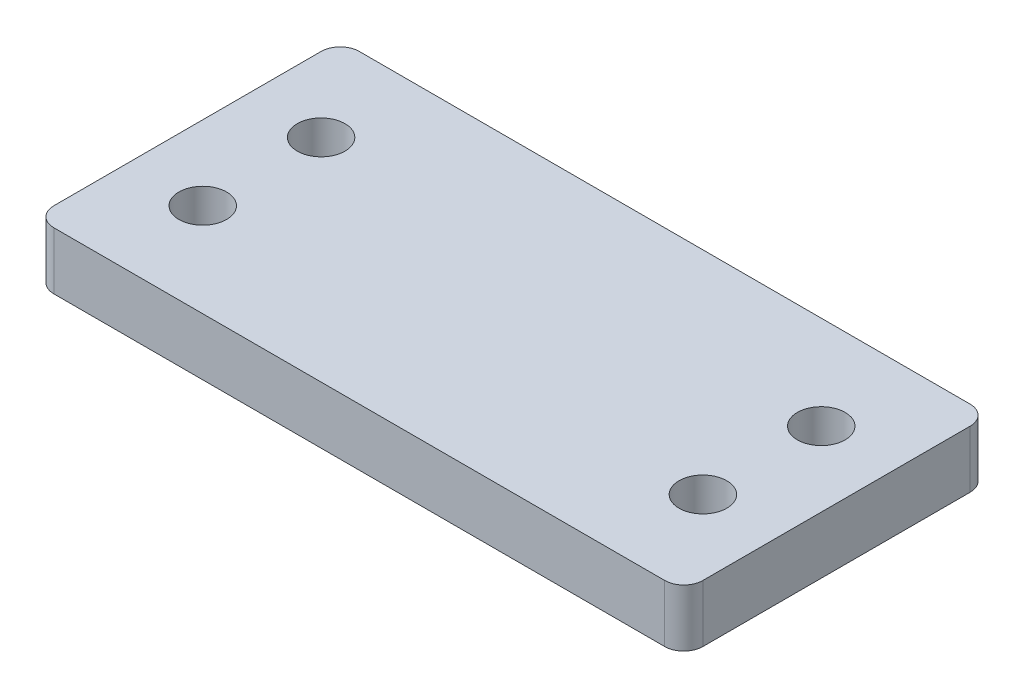
ISO-10303-21;
HEADER;
FILE_DESCRIPTION(('STEP AP214'),'2;1');
FILE_NAME('part.step','',(''),(''),'','','');
FILE_SCHEMA(('AUTOMOTIVE_DESIGN { 1 0 10303 214 1 1 1 1 }'));
ENDSEC;
DATA;
#1=APPLICATION_CONTEXT('core data for automotive mechanical design processes');
#2=APPLICATION_PROTOCOL_DEFINITION('international standard','automotive_design',2000,#1);
#3=PRODUCT_CONTEXT('',#1,'mechanical');
#4=PRODUCT('Part','Part','',(#3));
#5=PRODUCT_RELATED_PRODUCT_CATEGORY('part','',(#4));
#6=PRODUCT_DEFINITION_FORMATION('','',#4);
#7=PRODUCT_DEFINITION_CONTEXT('part definition',#1,'design');
#8=PRODUCT_DEFINITION('design','',#6,#7);
#9=PRODUCT_DEFINITION_SHAPE('','',#8);
#10=(LENGTH_UNIT() NAMED_UNIT(*) SI_UNIT(.MILLI.,.METRE.));
#11=(NAMED_UNIT(*) PLANE_ANGLE_UNIT() SI_UNIT($,.RADIAN.));
#12=(NAMED_UNIT(*) SI_UNIT($,.STERADIAN.) SOLID_ANGLE_UNIT());
#13=UNCERTAINTY_MEASURE_WITH_UNIT(LENGTH_MEASURE(1.E-05),#10,'distance_accuracy_value','');
#14=(GEOMETRIC_REPRESENTATION_CONTEXT(3) GLOBAL_UNCERTAINTY_ASSIGNED_CONTEXT((#13)) GLOBAL_UNIT_ASSIGNED_CONTEXT((#10,
#11,#12)) REPRESENTATION_CONTEXT('',''));
#15=CARTESIAN_POINT('',(0.,0.,0.));
#16=DIRECTION('',(0.,0.,1.));
#17=DIRECTION('',(1.,0.,0.));
#18=AXIS2_PLACEMENT_3D('',#15,#16,#17);
#19=CARTESIAN_POINT('',(0.,3.,0.));
#20=DIRECTION('',(0.,1.,0.));
#21=DIRECTION('',(0.,0.,1.));
#22=AXIS2_PLACEMENT_3D('',#19,#20,#21);
#23=PLANE('',#22);
#24=CARTESIAN_POINT('',(13.0999999996,3.,-3.10000000035001));
#25=DIRECTION('',(0.,1.,0.));
#26=DIRECTION('',(0.,0.,1.));
#27=AXIS2_PLACEMENT_3D('',#24,#25,#26);
#28=CIRCLE('',#27,1.2499999997);
#29=CARTESIAN_POINT('',(13.0999999996,3.,-1.85000000065001));
#30=VERTEX_POINT('',#29);
#31=EDGE_CURVE('E187',#30,#30,#28,.T.);
#32=ORIENTED_EDGE('',*,*,#31,.F.);
#33=EDGE_LOOP('',(#32));
#34=FACE_BOUND('',#33,.T.);
#35=CARTESIAN_POINT('',(-13.1,3.,3.10000000025));
#36=DIRECTION('',(0.,1.,0.));
#37=DIRECTION('',(0.,0.,1.));
#38=AXIS2_PLACEMENT_3D('',#35,#36,#37);
#39=CIRCLE('',#38,1.25000000025);
#40=CARTESIAN_POINT('',(-13.1,3.,4.35000000049999));
#41=VERTEX_POINT('',#40);
#42=EDGE_CURVE('E129',#41,#41,#39,.T.);
#43=ORIENTED_EDGE('',*,*,#42,.F.);
#44=EDGE_LOOP('',(#43));
#45=FACE_BOUND('',#44,.T.);
#46=DIRECTION('',(-1.,0.,0.));
#47=VECTOR('',#46,1.);
#48=CARTESIAN_POINT('',(-17.,3.,-8.));
#49=LINE('',#48,#47);
#50=CARTESIAN_POINT('',(16.,3.,-8.));
#51=VERTEX_POINT('',#50);
#52=CARTESIAN_POINT('',(-16.,3.,-8.));
#53=VERTEX_POINT('',#52);
#54=EDGE_CURVE('E138',#51,#53,#49,.T.);
#55=ORIENTED_EDGE('',*,*,#54,.T.);
#56=CARTESIAN_POINT('',(-16.,3.,-7.));
#57=DIRECTION('',(0.,1.,0.));
#58=DIRECTION('',(0.,0.,1.));
#59=AXIS2_PLACEMENT_3D('',#56,#57,#58);
#60=CIRCLE('',#59,1.);
#61=CARTESIAN_POINT('',(-17.,3.,-7.));
#62=VERTEX_POINT('',#61);
#63=EDGE_CURVE('E157',#53,#62,#60,.T.);
#64=ORIENTED_EDGE('',*,*,#63,.T.);
#65=DIRECTION('',(0.,0.,1.));
#66=VECTOR('',#65,1.);
#67=CARTESIAN_POINT('',(-17.,3.,-8.));
#68=LINE('',#67,#66);
#69=CARTESIAN_POINT('',(-17.,3.,7.));
#70=VERTEX_POINT('',#69);
#71=EDGE_CURVE('E121',#62,#70,#68,.T.);
#72=ORIENTED_EDGE('',*,*,#71,.T.);
#73=CARTESIAN_POINT('',(-16.,3.,7.));
#74=DIRECTION('',(0.,1.,0.));
#75=DIRECTION('',(0.,0.,1.));
#76=AXIS2_PLACEMENT_3D('',#73,#74,#75);
#77=CIRCLE('',#76,1.);
#78=CARTESIAN_POINT('',(-16.,3.,8.));
#79=VERTEX_POINT('',#78);
#80=EDGE_CURVE('E155',#70,#79,#77,.T.);
#81=ORIENTED_EDGE('',*,*,#80,.T.);
#82=DIRECTION('',(1.,0.,0.));
#83=VECTOR('',#82,1.);
#84=CARTESIAN_POINT('',(-17.,3.,8.));
#85=LINE('',#84,#83);
#86=CARTESIAN_POINT('',(16.,3.,8.));
#87=VERTEX_POINT('',#86);
#88=EDGE_CURVE('E177',#79,#87,#85,.T.);
#89=ORIENTED_EDGE('',*,*,#88,.T.);
#90=CARTESIAN_POINT('',(16.,3.,7.));
#91=DIRECTION('',(0.,1.,0.));
#92=DIRECTION('',(0.,0.,1.));
#93=AXIS2_PLACEMENT_3D('',#90,#91,#92);
#94=CIRCLE('',#93,1.);
#95=CARTESIAN_POINT('',(17.,3.,7.));
#96=VERTEX_POINT('',#95);
#97=EDGE_CURVE('E56',#87,#96,#94,.T.);
#98=ORIENTED_EDGE('',*,*,#97,.T.);
#99=DIRECTION('',(0.,0.,-1.));
#100=VECTOR('',#99,1.);
#101=CARTESIAN_POINT('',(17.,3.,-8.));
#102=LINE('',#101,#100);
#103=CARTESIAN_POINT('',(17.,3.,-7.));
#104=VERTEX_POINT('',#103);
#105=EDGE_CURVE('E167',#96,#104,#102,.T.);
#106=ORIENTED_EDGE('',*,*,#105,.T.);
#107=CARTESIAN_POINT('',(16.,3.,-7.));
#108=DIRECTION('',(0.,1.,0.));
#109=DIRECTION('',(0.,0.,1.));
#110=AXIS2_PLACEMENT_3D('',#107,#108,#109);
#111=CIRCLE('',#110,1.);
#112=EDGE_CURVE('E153',#104,#51,#111,.T.);
#113=ORIENTED_EDGE('',*,*,#112,.T.);
#114=EDGE_LOOP('',(#55,#64,#72,#81,#89,#98,#106,#113));
#115=FACE_BOUND('',#114,.T.);
#116=CARTESIAN_POINT('',(13.1,3.,3.10000000025));
#117=DIRECTION('',(0.,1.,0.));
#118=DIRECTION('',(0.,0.,1.));
#119=AXIS2_PLACEMENT_3D('',#116,#117,#118);
#120=CIRCLE('',#119,1.25000000025);
#121=CARTESIAN_POINT('',(13.1,3.,4.3500000005));
#122=VERTEX_POINT('',#121);
#123=EDGE_CURVE('E182',#122,#122,#120,.T.);
#124=ORIENTED_EDGE('',*,*,#123,.F.);
#125=EDGE_LOOP('',(#124));
#126=FACE_BOUND('',#125,.T.);
#127=CARTESIAN_POINT('',(-13.1,3.,-3.09999999975));
#128=DIRECTION('',(0.,1.,0.));
#129=DIRECTION('',(0.,0.,1.));
#130=AXIS2_PLACEMENT_3D('',#127,#128,#129);
#131=CIRCLE('',#130,1.2499999997);
#132=CARTESIAN_POINT('',(-13.1,3.,-1.85000000005));
#133=VERTEX_POINT('',#132);
#134=EDGE_CURVE('E193',#133,#133,#131,.T.);
#135=ORIENTED_EDGE('',*,*,#134,.F.);
#136=EDGE_LOOP('',(#135));
#137=FACE_BOUND('',#136,.T.);
#138=ADVANCED_FACE('F36',(#34,#45,#115,#126,#137),#23,.T.);
#139=CARTESIAN_POINT('',(0.,0.,0.));
#140=DIRECTION('',(0.,1.,0.));
#141=DIRECTION('',(0.,0.,1.));
#142=AXIS2_PLACEMENT_3D('',#139,#140,#141);
#143=PLANE('',#142);
#144=DIRECTION('',(0.,0.,1.));
#145=VECTOR('',#144,1.);
#146=CARTESIAN_POINT('',(-17.,0.,-8.));
#147=LINE('',#146,#145);
#148=CARTESIAN_POINT('',(-17.,0.,-7.));
#149=VERTEX_POINT('',#148);
#150=CARTESIAN_POINT('',(-17.,0.,7.));
#151=VERTEX_POINT('',#150);
#152=EDGE_CURVE('E118',#149,#151,#147,.T.);
#153=ORIENTED_EDGE('',*,*,#152,.F.);
#154=CARTESIAN_POINT('',(-16.,0.,-7.));
#155=DIRECTION('',(0.,1.,0.));
#156=DIRECTION('',(0.,0.,1.));
#157=AXIS2_PLACEMENT_3D('',#154,#155,#156);
#158=CIRCLE('',#157,1.);
#159=CARTESIAN_POINT('',(-16.,0.,-8.));
#160=VERTEX_POINT('',#159);
#161=EDGE_CURVE('E101',#149,#160,#158,.F.);
#162=ORIENTED_EDGE('',*,*,#161,.T.);
#163=DIRECTION('',(-1.,0.,0.));
#164=VECTOR('',#163,1.);
#165=CARTESIAN_POINT('',(-17.,0.,-8.));
#166=LINE('',#165,#164);
#167=CARTESIAN_POINT('',(16.,0.,-8.));
#168=VERTEX_POINT('',#167);
#169=EDGE_CURVE('E142',#168,#160,#166,.T.);
#170=ORIENTED_EDGE('',*,*,#169,.F.);
#171=CARTESIAN_POINT('',(16.,0.,-7.));
#172=DIRECTION('',(0.,1.,0.));
#173=DIRECTION('',(0.,0.,1.));
#174=AXIS2_PLACEMENT_3D('',#171,#172,#173);
#175=CIRCLE('',#174,1.);
#176=CARTESIAN_POINT('',(17.,0.,-7.));
#177=VERTEX_POINT('',#176);
#178=EDGE_CURVE('E146',#168,#177,#175,.F.);
#179=ORIENTED_EDGE('',*,*,#178,.T.);
#180=DIRECTION('',(0.,0.,-1.));
#181=VECTOR('',#180,1.);
#182=CARTESIAN_POINT('',(17.,0.,-8.));
#183=LINE('',#182,#181);
#184=CARTESIAN_POINT('',(17.,0.,7.));
#185=VERTEX_POINT('',#184);
#186=EDGE_CURVE('E132',#185,#177,#183,.T.);
#187=ORIENTED_EDGE('',*,*,#186,.F.);
#188=CARTESIAN_POINT('',(16.,0.,7.));
#189=DIRECTION('',(0.,1.,0.));
#190=DIRECTION('',(0.,0.,1.));
#191=AXIS2_PLACEMENT_3D('',#188,#189,#190);
#192=CIRCLE('',#191,1.);
#193=CARTESIAN_POINT('',(16.,0.,8.));
#194=VERTEX_POINT('',#193);
#195=EDGE_CURVE('E122',#185,#194,#192,.F.);
#196=ORIENTED_EDGE('',*,*,#195,.T.);
#197=DIRECTION('',(1.,0.,0.));
#198=VECTOR('',#197,1.);
#199=CARTESIAN_POINT('',(-17.,0.,8.));
#200=LINE('',#199,#198);
#201=CARTESIAN_POINT('',(-16.,0.,8.));
#202=VERTEX_POINT('',#201);
#203=EDGE_CURVE('E128',#202,#194,#200,.T.);
#204=ORIENTED_EDGE('',*,*,#203,.F.);
#205=CARTESIAN_POINT('',(-16.,0.,7.));
#206=DIRECTION('',(0.,1.,0.));
#207=DIRECTION('',(0.,0.,1.));
#208=AXIS2_PLACEMENT_3D('',#205,#206,#207);
#209=CIRCLE('',#208,1.);
#210=EDGE_CURVE('E112',#202,#151,#209,.F.);
#211=ORIENTED_EDGE('',*,*,#210,.T.);
#212=EDGE_LOOP('',(#153,#162,#170,#179,#187,#196,#204,#211));
#213=FACE_BOUND('',#212,.T.);
#214=CARTESIAN_POINT('',(-13.1,0.,3.10000000025));
#215=DIRECTION('',(0.,1.,0.));
#216=DIRECTION('',(0.,0.,1.));
#217=AXIS2_PLACEMENT_3D('',#214,#215,#216);
#218=CIRCLE('',#217,1.25000000025);
#219=CARTESIAN_POINT('',(-13.1,0.,4.35000000049999));
#220=VERTEX_POINT('',#219);
#221=EDGE_CURVE('E135',#220,#220,#218,.T.);
#222=ORIENTED_EDGE('',*,*,#221,.T.);
#223=EDGE_LOOP('',(#222));
#224=FACE_BOUND('',#223,.T.);
#225=CARTESIAN_POINT('',(13.0999999998,0.,3.10000000025));
#226=DIRECTION('',(0.,1.,0.));
#227=DIRECTION('',(0.,0.,1.));
#228=AXIS2_PLACEMENT_3D('',#225,#226,#227);
#229=CIRCLE('',#228,1.25000000025);
#230=CARTESIAN_POINT('',(13.0999999998,0.,4.3500000005));
#231=VERTEX_POINT('',#230);
#232=EDGE_CURVE('E184',#231,#231,#229,.T.);
#233=ORIENTED_EDGE('',*,*,#232,.T.);
#234=EDGE_LOOP('',(#233));
#235=FACE_BOUND('',#234,.T.);
#236=CARTESIAN_POINT('',(13.0999999998,0.,-3.10000000035001));
#237=DIRECTION('',(0.,1.,0.));
#238=DIRECTION('',(0.,0.,1.));
#239=AXIS2_PLACEMENT_3D('',#236,#237,#238);
#240=CIRCLE('',#239,1.2499999997);
#241=CARTESIAN_POINT('',(13.0999999998,0.,-1.85000000065001));
#242=VERTEX_POINT('',#241);
#243=EDGE_CURVE('E190',#242,#242,#240,.T.);
#244=ORIENTED_EDGE('',*,*,#243,.T.);
#245=EDGE_LOOP('',(#244));
#246=FACE_BOUND('',#245,.T.);
#247=CARTESIAN_POINT('',(-13.1,0.,-3.09999999975));
#248=DIRECTION('',(0.,1.,0.));
#249=DIRECTION('',(0.,0.,1.));
#250=AXIS2_PLACEMENT_3D('',#247,#248,#249);
#251=CIRCLE('',#250,1.2499999997);
#252=CARTESIAN_POINT('',(-13.1,0.,-1.85000000005));
#253=VERTEX_POINT('',#252);
#254=EDGE_CURVE('E196',#253,#253,#251,.T.);
#255=ORIENTED_EDGE('',*,*,#254,.T.);
#256=EDGE_LOOP('',(#255));
#257=FACE_BOUND('',#256,.T.);
#258=ADVANCED_FACE('F125',(#213,#224,#235,#246,#257),#143,.F.);
#259=CARTESIAN_POINT('',(-17.,3.,-8.));
#260=DIRECTION('',(1.,0.,0.));
#261=DIRECTION('',(0.,0.,-1.));
#262=AXIS2_PLACEMENT_3D('',#259,#260,#261);
#263=PLANE('',#262);
#264=ORIENTED_EDGE('',*,*,#71,.F.);
#265=DIRECTION('',(0.,-1.,0.));
#266=VECTOR('',#265,1.);
#267=CARTESIAN_POINT('',(-17.,3.,-7.));
#268=LINE('',#267,#266);
#269=EDGE_CURVE('E105',#62,#149,#268,.T.);
#270=ORIENTED_EDGE('',*,*,#269,.T.);
#271=ORIENTED_EDGE('',*,*,#152,.T.);
#272=DIRECTION('',(0.,-1.,0.));
#273=VECTOR('',#272,1.);
#274=CARTESIAN_POINT('',(-17.,3.,7.));
#275=LINE('',#274,#273);
#276=EDGE_CURVE('E123',#151,#70,#275,.F.);
#277=ORIENTED_EDGE('',*,*,#276,.T.);
#278=EDGE_LOOP('',(#264,#270,#271,#277));
#279=FACE_BOUND('',#278,.T.);
#280=ADVANCED_FACE('F117',(#279),#263,.F.);
#281=CARTESIAN_POINT('',(-17.,3.,8.));
#282=DIRECTION('',(0.,0.,-1.));
#283=DIRECTION('',(-1.,0.,0.));
#284=AXIS2_PLACEMENT_3D('',#281,#282,#283);
#285=PLANE('',#284);
#286=ORIENTED_EDGE('',*,*,#88,.F.);
#287=DIRECTION('',(0.,-1.,0.));
#288=VECTOR('',#287,1.);
#289=CARTESIAN_POINT('',(-16.,3.,8.));
#290=LINE('',#289,#288);
#291=EDGE_CURVE('E161',#79,#202,#290,.T.);
#292=ORIENTED_EDGE('',*,*,#291,.T.);
#293=ORIENTED_EDGE('',*,*,#203,.T.);
#294=DIRECTION('',(0.,-1.,0.));
#295=VECTOR('',#294,1.);
#296=CARTESIAN_POINT('',(16.,3.,8.));
#297=LINE('',#296,#295);
#298=EDGE_CURVE('E159',#194,#87,#297,.F.);
#299=ORIENTED_EDGE('',*,*,#298,.T.);
#300=EDGE_LOOP('',(#286,#292,#293,#299));
#301=FACE_BOUND('',#300,.T.);
#302=ADVANCED_FACE('F221',(#301),#285,.F.);
#303=CARTESIAN_POINT('',(17.,3.,-8.));
#304=DIRECTION('',(-1.,0.,0.));
#305=DIRECTION('',(0.,0.,1.));
#306=AXIS2_PLACEMENT_3D('',#303,#304,#305);
#307=PLANE('',#306);
#308=ORIENTED_EDGE('',*,*,#186,.T.);
#309=DIRECTION('',(0.,-1.,0.));
#310=VECTOR('',#309,1.);
#311=CARTESIAN_POINT('',(17.,3.,-7.));
#312=LINE('',#311,#310);
#313=EDGE_CURVE('E11',#177,#104,#312,.F.);
#314=ORIENTED_EDGE('',*,*,#313,.T.);
#315=ORIENTED_EDGE('',*,*,#105,.F.);
#316=DIRECTION('',(0.,-1.,0.));
#317=VECTOR('',#316,1.);
#318=CARTESIAN_POINT('',(17.,3.,7.));
#319=LINE('',#318,#317);
#320=EDGE_CURVE('E44',#96,#185,#319,.T.);
#321=ORIENTED_EDGE('',*,*,#320,.T.);
#322=EDGE_LOOP('',(#308,#314,#315,#321));
#323=FACE_BOUND('',#322,.T.);
#324=ADVANCED_FACE('F166',(#323),#307,.F.);
#325=CARTESIAN_POINT('',(-17.,3.,-8.));
#326=DIRECTION('',(0.,0.,1.));
#327=DIRECTION('',(1.,0.,0.));
#328=AXIS2_PLACEMENT_3D('',#325,#326,#327);
#329=PLANE('',#328);
#330=ORIENTED_EDGE('',*,*,#169,.T.);
#331=DIRECTION('',(0.,-1.,0.));
#332=VECTOR('',#331,1.);
#333=CARTESIAN_POINT('',(-16.,3.,-8.));
#334=LINE('',#333,#332);
#335=EDGE_CURVE('E106',#160,#53,#334,.F.);
#336=ORIENTED_EDGE('',*,*,#335,.T.);
#337=ORIENTED_EDGE('',*,*,#54,.F.);
#338=DIRECTION('',(0.,-1.,0.));
#339=VECTOR('',#338,1.);
#340=CARTESIAN_POINT('',(16.,3.,-8.));
#341=LINE('',#340,#339);
#342=EDGE_CURVE('E111',#51,#168,#341,.T.);
#343=ORIENTED_EDGE('',*,*,#342,.T.);
#344=EDGE_LOOP('',(#330,#336,#337,#343));
#345=FACE_BOUND('',#344,.T.);
#346=ADVANCED_FACE('F175',(#345),#329,.F.);
#347=CARTESIAN_POINT('',(-13.1,3.,3.10000000025));
#348=DIRECTION('',(0.,-1.,0.));
#349=DIRECTION('',(0.,0.,-1.));
#350=AXIS2_PLACEMENT_3D('',#347,#348,#349);
#351=CYLINDRICAL_SURFACE('',#350,1.25000000025);
#352=ORIENTED_EDGE('',*,*,#221,.F.);
#353=EDGE_LOOP('',(#352));
#354=FACE_BOUND('',#353,.T.);
#355=ORIENTED_EDGE('',*,*,#42,.T.);
#356=EDGE_LOOP('',(#355));
#357=FACE_BOUND('',#356,.T.);
#358=ADVANCED_FACE('F214',(#354,#357),#351,.F.);
#359=CARTESIAN_POINT('',(13.0999999998,3.,3.10000000025));
#360=DIRECTION('',(0.,-1.,0.));
#361=DIRECTION('',(0.,0.,-1.));
#362=AXIS2_PLACEMENT_3D('',#359,#360,#361);
#363=CYLINDRICAL_SURFACE('',#362,1.25000000025);
#364=ORIENTED_EDGE('',*,*,#232,.F.);
#365=EDGE_LOOP('',(#364));
#366=FACE_BOUND('',#365,.T.);
#367=ORIENTED_EDGE('',*,*,#123,.T.);
#368=EDGE_LOOP('',(#367));
#369=FACE_BOUND('',#368,.T.);
#370=ADVANCED_FACE('F245',(#366,#369),#363,.F.);
#371=CARTESIAN_POINT('',(13.0999999998,3.,-3.10000000035001));
#372=DIRECTION('',(0.,-1.,0.));
#373=DIRECTION('',(0.,0.,-1.));
#374=AXIS2_PLACEMENT_3D('',#371,#372,#373);
#375=CYLINDRICAL_SURFACE('',#374,1.2499999997);
#376=ORIENTED_EDGE('',*,*,#243,.F.);
#377=EDGE_LOOP('',(#376));
#378=FACE_BOUND('',#377,.T.);
#379=ORIENTED_EDGE('',*,*,#31,.T.);
#380=EDGE_LOOP('',(#379));
#381=FACE_BOUND('',#380,.T.);
#382=ADVANCED_FACE('F247',(#378,#381),#375,.F.);
#383=CARTESIAN_POINT('',(-13.1,3.,-3.09999999975));
#384=DIRECTION('',(0.,-1.,0.));
#385=DIRECTION('',(0.,0.,-1.));
#386=AXIS2_PLACEMENT_3D('',#383,#384,#385);
#387=CYLINDRICAL_SURFACE('',#386,1.2499999997);
#388=ORIENTED_EDGE('',*,*,#254,.F.);
#389=EDGE_LOOP('',(#388));
#390=FACE_BOUND('',#389,.T.);
#391=ORIENTED_EDGE('',*,*,#134,.T.);
#392=EDGE_LOOP('',(#391));
#393=FACE_BOUND('',#392,.T.);
#394=ADVANCED_FACE('F202',(#390,#393),#387,.F.);
#395=CARTESIAN_POINT('',(-16.,3.,-7.));
#396=DIRECTION('',(0.,-1.,0.));
#397=DIRECTION('',(0.,0.,-1.));
#398=AXIS2_PLACEMENT_3D('',#395,#396,#397);
#399=CYLINDRICAL_SURFACE('',#398,1.);
#400=ORIENTED_EDGE('',*,*,#63,.F.);
#401=ORIENTED_EDGE('',*,*,#335,.F.);
#402=ORIENTED_EDGE('',*,*,#161,.F.);
#403=ORIENTED_EDGE('',*,*,#269,.F.);
#404=EDGE_LOOP('',(#400,#401,#402,#403));
#405=FACE_BOUND('',#404,.T.);
#406=ADVANCED_FACE('F104',(#405),#399,.T.);
#407=CARTESIAN_POINT('',(-16.,3.,7.));
#408=DIRECTION('',(0.,-1.,0.));
#409=DIRECTION('',(0.,0.,-1.));
#410=AXIS2_PLACEMENT_3D('',#407,#408,#409);
#411=CYLINDRICAL_SURFACE('',#410,1.);
#412=ORIENTED_EDGE('',*,*,#80,.F.);
#413=ORIENTED_EDGE('',*,*,#276,.F.);
#414=ORIENTED_EDGE('',*,*,#210,.F.);
#415=ORIENTED_EDGE('',*,*,#291,.F.);
#416=EDGE_LOOP('',(#412,#413,#414,#415));
#417=FACE_BOUND('',#416,.T.);
#418=ADVANCED_FACE('F229',(#417),#411,.T.);
#419=CARTESIAN_POINT('',(16.,3.,-7.));
#420=DIRECTION('',(0.,-1.,0.));
#421=DIRECTION('',(0.,0.,-1.));
#422=AXIS2_PLACEMENT_3D('',#419,#420,#421);
#423=CYLINDRICAL_SURFACE('',#422,1.);
#424=ORIENTED_EDGE('',*,*,#112,.F.);
#425=ORIENTED_EDGE('',*,*,#313,.F.);
#426=ORIENTED_EDGE('',*,*,#178,.F.);
#427=ORIENTED_EDGE('',*,*,#342,.F.);
#428=EDGE_LOOP('',(#424,#425,#426,#427));
#429=FACE_BOUND('',#428,.T.);
#430=ADVANCED_FACE('F172',(#429),#423,.T.);
#431=CARTESIAN_POINT('',(16.,3.,7.));
#432=DIRECTION('',(0.,-1.,0.));
#433=DIRECTION('',(0.,0.,-1.));
#434=AXIS2_PLACEMENT_3D('',#431,#432,#433);
#435=CYLINDRICAL_SURFACE('',#434,1.);
#436=ORIENTED_EDGE('',*,*,#97,.F.);
#437=ORIENTED_EDGE('',*,*,#298,.F.);
#438=ORIENTED_EDGE('',*,*,#195,.F.);
#439=ORIENTED_EDGE('',*,*,#320,.F.);
#440=EDGE_LOOP('',(#436,#437,#438,#439));
#441=FACE_BOUND('',#440,.T.);
#442=ADVANCED_FACE('F38',(#441),#435,.T.);
#443=CLOSED_SHELL('',(#138,#258,#280,#302,#324,#346,#358,#370,#382,#394,#406,#418,#430,#442));
#444=MANIFOLD_SOLID_BREP('B2',#443);
#445=ADVANCED_BREP_SHAPE_REPRESENTATION('',(#18,#444),#14);
#446=SHAPE_DEFINITION_REPRESENTATION(#9,#445);
ENDSEC;
END-ISO-10303-21;
